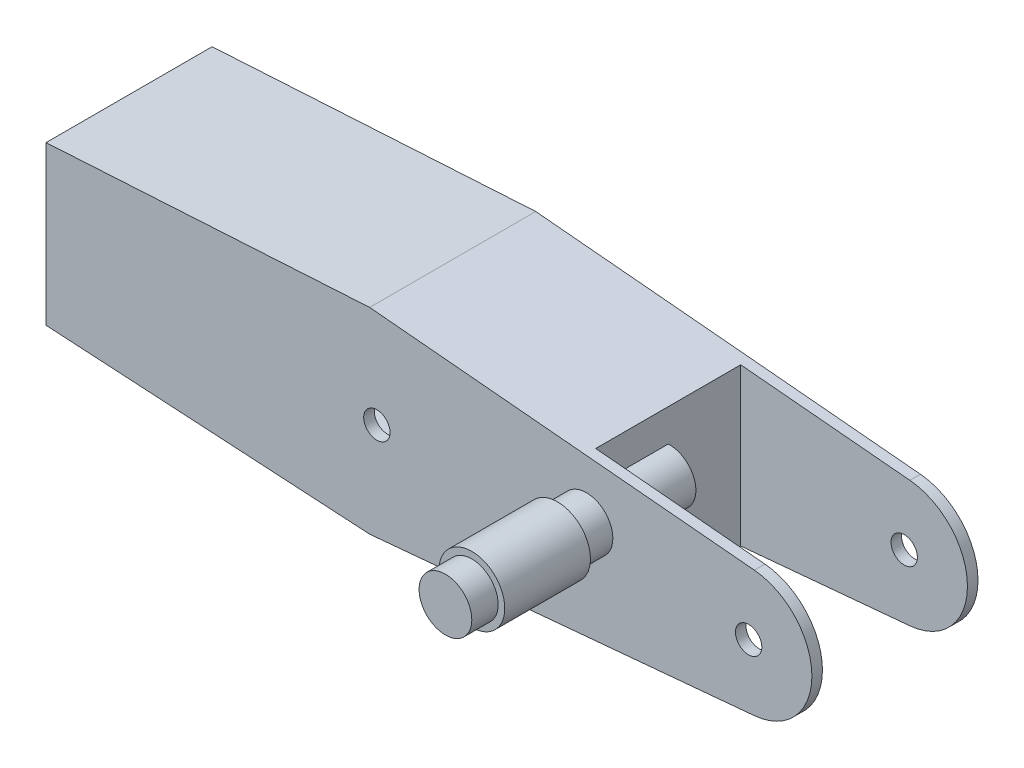
ISO-10303-21;
HEADER;
FILE_DESCRIPTION(('STEP AP214'),'2;1');
FILE_NAME('part.step','',(''),(''),'','','');
FILE_SCHEMA(('AUTOMOTIVE_DESIGN { 1 0 10303 214 1 1 1 1 }'));
ENDSEC;
DATA;
#1=APPLICATION_CONTEXT('core data for automotive mechanical design processes');
#2=APPLICATION_PROTOCOL_DEFINITION('international standard','automotive_design',2000,#1);
#3=PRODUCT_CONTEXT('',#1,'mechanical');
#4=PRODUCT('Part','Part','',(#3));
#5=PRODUCT_RELATED_PRODUCT_CATEGORY('part','',(#4));
#6=PRODUCT_DEFINITION_FORMATION('','',#4);
#7=PRODUCT_DEFINITION_CONTEXT('part definition',#1,'design');
#8=PRODUCT_DEFINITION('design','',#6,#7);
#9=PRODUCT_DEFINITION_SHAPE('','',#8);
#10=(LENGTH_UNIT() NAMED_UNIT(*) SI_UNIT(.MILLI.,.METRE.));
#11=(NAMED_UNIT(*) PLANE_ANGLE_UNIT() SI_UNIT($,.RADIAN.));
#12=(NAMED_UNIT(*) SI_UNIT($,.STERADIAN.) SOLID_ANGLE_UNIT());
#13=UNCERTAINTY_MEASURE_WITH_UNIT(LENGTH_MEASURE(1.E-05),#10,'distance_accuracy_value','');
#14=(GEOMETRIC_REPRESENTATION_CONTEXT(3) GLOBAL_UNCERTAINTY_ASSIGNED_CONTEXT((#13)) GLOBAL_UNIT_ASSIGNED_CONTEXT((#10,
#11,#12)) REPRESENTATION_CONTEXT('',''));
#15=CARTESIAN_POINT('',(0.,0.,0.));
#16=DIRECTION('',(0.,0.,1.));
#17=DIRECTION('',(1.,0.,0.));
#18=AXIS2_PLACEMENT_3D('',#15,#16,#17);
#19=CARTESIAN_POINT('',(159.,15.,213.));
#20=DIRECTION('',(0.,0.,1.));
#21=DIRECTION('',(1.,0.,0.));
#22=AXIS2_PLACEMENT_3D('',#19,#20,#21);
#23=PLANE('',#22);
#24=CARTESIAN_POINT('',(159.,15.,213.));
#25=DIRECTION('',(0.,0.,1.));
#26=DIRECTION('',(1.,0.,0.));
#27=AXIS2_PLACEMENT_3D('',#24,#25,#26);
#28=CIRCLE('',#27,25.);
#29=CARTESIAN_POINT('',(184.,15.,213.));
#30=VERTEX_POINT('',#29);
#31=EDGE_CURVE('E191',#30,#30,#28,.T.);
#32=ORIENTED_EDGE('',*,*,#31,.T.);
#33=EDGE_LOOP('',(#32));
#34=FACE_BOUND('',#33,.T.);
#35=CARTESIAN_POINT('',(159.,15.,213.));
#36=DIRECTION('',(0.,0.,1.));
#37=DIRECTION('',(1.,0.,0.));
#38=AXIS2_PLACEMENT_3D('',#35,#36,#37);
#39=CIRCLE('',#38,20.);
#40=CARTESIAN_POINT('',(179.,15.,213.));
#41=VERTEX_POINT('',#40);
#42=EDGE_CURVE('E331',#41,#41,#39,.T.);
#43=ORIENTED_EDGE('',*,*,#42,.F.);
#44=EDGE_LOOP('',(#43));
#45=FACE_BOUND('',#44,.T.);
#46=ADVANCED_FACE('F40',(#34,#45),#23,.T.);
#47=CARTESIAN_POINT('',(282.,0.,126.));
#48=DIRECTION('',(0.,0.,1.));
#49=DIRECTION('',(1.,0.,0.));
#50=AXIS2_PLACEMENT_3D('',#47,#48,#49);
#51=PLANE('',#50);
#52=CARTESIAN_POINT('',(0.,0.,126.));
#53=DIRECTION('',(0.,0.,1.));
#54=DIRECTION('',(1.,0.,0.));
#55=AXIS2_PLACEMENT_3D('',#52,#53,#54);
#56=CIRCLE('',#55,10.);
#57=CARTESIAN_POINT('',(10.,0.,126.));
#58=VERTEX_POINT('',#57);
#59=EDGE_CURVE('E749',#58,#58,#56,.T.);
#60=ORIENTED_EDGE('',*,*,#59,.F.);
#61=EDGE_LOOP('',(#60));
#62=FACE_BOUND('',#61,.T.);
#63=CARTESIAN_POINT('',(282.,0.,126.));
#64=DIRECTION('',(0.,0.,1.));
#65=DIRECTION('',(1.,0.,0.));
#66=AXIS2_PLACEMENT_3D('',#63,#64,#65);
#67=CIRCLE('',#66,9.99999999999998);
#68=CARTESIAN_POINT('',(292.,0.,126.));
#69=VERTEX_POINT('',#68);
#70=EDGE_CURVE('E334',#69,#69,#67,.T.);
#71=ORIENTED_EDGE('',*,*,#70,.F.);
#72=EDGE_LOOP('',(#71));
#73=FACE_BOUND('',#72,.T.);
#74=DIRECTION('',(-0.998260625193908,-0.0589552727706961,0.));
#75=VECTOR('',#74,1.);
#76=CARTESIAN_POINT('',(-251.,60.,126.));
#77=LINE('',#76,#75);
#78=CARTESIAN_POINT('',(-5.47863464883484,74.5,126.));
#79=VERTEX_POINT('',#78);
#80=CARTESIAN_POINT('',(-251.,60.,126.));
#81=VERTEX_POINT('',#80);
#82=EDGE_CURVE('E288',#79,#81,#77,.T.);
#83=ORIENTED_EDGE('',*,*,#82,.T.);
#84=DIRECTION('',(0.,-1.,0.));
#85=VECTOR('',#84,1.);
#86=CARTESIAN_POINT('',(-251.,60.,126.));
#87=LINE('',#86,#85);
#88=CARTESIAN_POINT('',(-251.,-60.,126.));
#89=VERTEX_POINT('',#88);
#90=EDGE_CURVE('E291',#81,#89,#87,.T.);
#91=ORIENTED_EDGE('',*,*,#90,.T.);
#92=DIRECTION('',(0.998260625193908,-0.0589552727706961,0.));
#93=VECTOR('',#92,1.);
#94=CARTESIAN_POINT('',(-251.,-60.,126.));
#95=LINE('',#94,#93);
#96=CARTESIAN_POINT('',(-5.47863464883484,-74.5,126.));
#97=VERTEX_POINT('',#96);
#98=EDGE_CURVE('E293',#89,#97,#95,.T.);
#99=ORIENTED_EDGE('',*,*,#98,.T.);
#100=DIRECTION('',(0.995841467620522,0.0911030809984231,0.));
#101=VECTOR('',#100,1.);
#102=CARTESIAN_POINT('',(-5.47863464883484,-74.5,126.));
#103=LINE('',#102,#101);
#104=CARTESIAN_POINT('',(286.372947887924,-47.800390445785,126.));
#105=VERTEX_POINT('',#104);
#106=EDGE_CURVE('E295',#97,#105,#103,.T.);
#107=ORIENTED_EDGE('',*,*,#106,.T.);
#108=CARTESIAN_POINT('',(282.,0.,126.));
#109=DIRECTION('',(0.,0.,1.));
#110=DIRECTION('',(1.,0.,0.));
#111=AXIS2_PLACEMENT_3D('',#108,#109,#110);
#112=CIRCLE('',#111,48.);
#113=CARTESIAN_POINT('',(286.372947887924,47.800390445785,126.));
#114=VERTEX_POINT('',#113);
#115=EDGE_CURVE('E297',#105,#114,#112,.T.);
#116=ORIENTED_EDGE('',*,*,#115,.T.);
#117=DIRECTION('',(-0.995841467620522,0.0911030809984231,0.));
#118=VECTOR('',#117,1.);
#119=CARTESIAN_POINT('',(-5.47863464883484,74.5,126.));
#120=LINE('',#119,#118);
#121=EDGE_CURVE('E299',#114,#79,#120,.T.);
#122=ORIENTED_EDGE('',*,*,#121,.T.);
#123=EDGE_LOOP('',(#83,#91,#99,#107,#116,#122));
#124=FACE_BOUND('',#123,.T.);
#125=CARTESIAN_POINT('',(159.,15.,126.));
#126=DIRECTION('',(0.,0.,1.));
#127=DIRECTION('',(1.,0.,0.));
#128=AXIS2_PLACEMENT_3D('',#125,#126,#127);
#129=CIRCLE('',#128,20.);
#130=CARTESIAN_POINT('',(179.,15.,126.));
#131=VERTEX_POINT('',#130);
#132=EDGE_CURVE('E186',#131,#131,#129,.F.);
#133=ORIENTED_EDGE('',*,*,#132,.T.);
#134=EDGE_LOOP('',(#133));
#135=FACE_BOUND('',#134,.T.);
#136=ADVANCED_FACE('F401',(#62,#73,#124,#135),#51,.T.);
#137=CARTESIAN_POINT('',(158.,-100.,118.));
#138=DIRECTION('',(1.,0.,0.));
#139=DIRECTION('',(0.,0.,-1.));
#140=AXIS2_PLACEMENT_3D('',#137,#138,#139);
#141=PLANE('',#140);
#142=DIRECTION('',(0.,-1.,0.));
#143=VECTOR('',#142,1.);
#144=CARTESIAN_POINT('',(158.,-100.,63.));
#145=LINE('',#144,#143);
#146=CARTESIAN_POINT('',(158.,34.9749843554382,63.));
#147=VERTEX_POINT('',#146);
#148=CARTESIAN_POINT('',(158.,-4.97498435543817,63.));
#149=VERTEX_POINT('',#148);
#150=EDGE_CURVE('E180',#147,#149,#145,.T.);
#151=ORIENTED_EDGE('',*,*,#150,.T.);
#152=DIRECTION('',(0.,0.,-1.));
#153=VECTOR('',#152,1.);
#154=CARTESIAN_POINT('',(158.,-4.97498435543817,148.));
#155=LINE('',#154,#153);
#156=CARTESIAN_POINT('',(158.,-4.97498435543817,118.));
#157=VERTEX_POINT('',#156);
#158=EDGE_CURVE('E189',#149,#157,#155,.F.);
#159=ORIENTED_EDGE('',*,*,#158,.T.);
#160=DIRECTION('',(0.,-1.,0.));
#161=VECTOR('',#160,1.);
#162=CARTESIAN_POINT('',(158.,40.,118.));
#163=LINE('',#162,#161);
#164=CARTESIAN_POINT('',(158.,-59.5443993565452,118.));
#165=VERTEX_POINT('',#164);
#166=EDGE_CURVE('E252',#157,#165,#163,.T.);
#167=ORIENTED_EDGE('',*,*,#166,.T.);
#168=DIRECTION('',(0.,0.,-1.));
#169=VECTOR('',#168,1.);
#170=CARTESIAN_POINT('',(158.,-59.5443993565452,126.));
#171=LINE('',#170,#169);
#172=CARTESIAN_POINT('',(158.,-59.5443993565452,8.00000000000001));
#173=VERTEX_POINT('',#172);
#174=EDGE_CURVE('E321',#165,#173,#171,.T.);
#175=ORIENTED_EDGE('',*,*,#174,.T.);
#176=DIRECTION('',(0.,1.,0.));
#177=VECTOR('',#176,1.);
#178=CARTESIAN_POINT('',(158.,40.,8.00000000000002));
#179=LINE('',#178,#177);
#180=CARTESIAN_POINT('',(158.,59.5443993565452,8.));
#181=VERTEX_POINT('',#180);
#182=EDGE_CURVE('E263',#173,#181,#179,.T.);
#183=ORIENTED_EDGE('',*,*,#182,.T.);
#184=DIRECTION('',(0.,0.,1.));
#185=VECTOR('',#184,1.);
#186=CARTESIAN_POINT('',(158.,59.5443993565452,8.));
#187=LINE('',#186,#185);
#188=CARTESIAN_POINT('',(158.,59.5443993565452,118.));
#189=VERTEX_POINT('',#188);
#190=EDGE_CURVE('E185',#181,#189,#187,.T.);
#191=ORIENTED_EDGE('',*,*,#190,.T.);
#192=CARTESIAN_POINT('',(158.,34.9749843554382,118.));
#193=VERTEX_POINT('',#192);
#194=EDGE_CURVE('E196',#189,#193,#163,.T.);
#195=ORIENTED_EDGE('',*,*,#194,.T.);
#196=DIRECTION('',(0.,0.,-1.));
#197=VECTOR('',#196,1.);
#198=CARTESIAN_POINT('',(158.,34.9749843554382,148.));
#199=LINE('',#198,#197);
#200=EDGE_CURVE('E57',#193,#147,#199,.T.);
#201=ORIENTED_EDGE('',*,*,#200,.T.);
#202=EDGE_LOOP('',(#151,#159,#167,#175,#183,#191,#195,#201));
#203=FACE_BOUND('',#202,.T.);
#204=ADVANCED_FACE('F194',(#203),#141,.T.);
#205=CARTESIAN_POINT('',(358.,40.,118.));
#206=DIRECTION('',(0.,0.,-1.));
#207=DIRECTION('',(0.,1.,0.));
#208=AXIS2_PLACEMENT_3D('',#205,#206,#207);
#209=PLANE('',#208);
#210=CARTESIAN_POINT('',(282.,0.,118.));
#211=DIRECTION('',(0.,0.,-1.));
#212=DIRECTION('',(0.,1.,0.));
#213=AXIS2_PLACEMENT_3D('',#210,#211,#212);
#214=CIRCLE('',#213,9.99999999999998);
#215=CARTESIAN_POINT('',(282.,9.99999999999998,118.));
#216=VERTEX_POINT('',#215);
#217=EDGE_CURVE('E326',#216,#216,#214,.T.);
#218=ORIENTED_EDGE('',*,*,#217,.F.);
#219=EDGE_LOOP('',(#218));
#220=FACE_BOUND('',#219,.T.);
#221=ORIENTED_EDGE('',*,*,#166,.F.);
#222=CARTESIAN_POINT('',(159.,15.,118.));
#223=DIRECTION('',(0.,0.,-1.));
#224=DIRECTION('',(0.,1.,0.));
#225=AXIS2_PLACEMENT_3D('',#222,#223,#224);
#226=CIRCLE('',#225,20.);
#227=EDGE_CURVE('E197',#157,#193,#226,.F.);
#228=ORIENTED_EDGE('',*,*,#227,.T.);
#229=ORIENTED_EDGE('',*,*,#194,.F.);
#230=DIRECTION('',(-0.995841467620522,0.0911030809984231,0.));
#231=VECTOR('',#230,1.);
#232=CARTESIAN_POINT('',(-5.47863464883484,74.5,118.));
#233=LINE('',#232,#231);
#234=CARTESIAN_POINT('',(286.372947887924,47.800390445785,118.));
#235=VERTEX_POINT('',#234);
#236=EDGE_CURVE('E206',#235,#189,#233,.T.);
#237=ORIENTED_EDGE('',*,*,#236,.F.);
#238=CARTESIAN_POINT('',(282.,0.,118.));
#239=DIRECTION('',(0.,0.,-1.));
#240=DIRECTION('',(0.,1.,0.));
#241=AXIS2_PLACEMENT_3D('',#238,#239,#240);
#242=CIRCLE('',#241,48.);
#243=CARTESIAN_POINT('',(286.372947887924,-47.800390445785,118.));
#244=VERTEX_POINT('',#243);
#245=EDGE_CURVE('E319',#235,#244,#242,.T.);
#246=ORIENTED_EDGE('',*,*,#245,.T.);
#247=DIRECTION('',(-0.995841467620522,-0.0911030809984231,0.));
#248=VECTOR('',#247,1.);
#249=CARTESIAN_POINT('',(-5.47863464883484,-74.5,118.));
#250=LINE('',#249,#248);
#251=EDGE_CURVE('E267',#244,#165,#250,.T.);
#252=ORIENTED_EDGE('',*,*,#251,.T.);
#253=EDGE_LOOP('',(#221,#228,#229,#237,#246,#252));
#254=FACE_BOUND('',#253,.T.);
#255=ADVANCED_FACE('F444',(#220,#254),#209,.T.);
#256=CARTESIAN_POINT('',(282.,0.,126.));
#257=DIRECTION('',(0.,0.,-1.));
#258=DIRECTION('',(-1.,0.,0.));
#259=AXIS2_PLACEMENT_3D('',#256,#257,#258);
#260=CYLINDRICAL_SURFACE('',#259,48.);
#261=DIRECTION('',(0.,0.,-1.));
#262=VECTOR('',#261,1.);
#263=CARTESIAN_POINT('',(286.372947887924,47.800390445785,126.));
#264=LINE('',#263,#262);
#265=CARTESIAN_POINT('',(286.372947887924,47.800390445785,8.00000000000001));
#266=VERTEX_POINT('',#265);
#267=CARTESIAN_POINT('',(286.372947887924,47.800390445785,0.));
#268=VERTEX_POINT('',#267);
#269=EDGE_CURVE('E303',#266,#268,#264,.T.);
#270=ORIENTED_EDGE('',*,*,#269,.F.);
#271=CARTESIAN_POINT('',(282.,0.,8.00000000000002));
#272=DIRECTION('',(0.,0.,1.));
#273=DIRECTION('',(0.,-1.,0.));
#274=AXIS2_PLACEMENT_3D('',#271,#272,#273);
#275=CIRCLE('',#274,48.);
#276=CARTESIAN_POINT('',(286.372947887924,-47.800390445785,8.00000000000001));
#277=VERTEX_POINT('',#276);
#278=EDGE_CURVE('E317',#277,#266,#275,.T.);
#279=ORIENTED_EDGE('',*,*,#278,.F.);
#280=DIRECTION('',(0.,0.,-1.));
#281=VECTOR('',#280,1.);
#282=CARTESIAN_POINT('',(286.372947887924,-47.800390445785,126.));
#283=LINE('',#282,#281);
#284=CARTESIAN_POINT('',(286.372947887924,-47.800390445785,0.));
#285=VERTEX_POINT('',#284);
#286=EDGE_CURVE('E307',#277,#285,#283,.T.);
#287=ORIENTED_EDGE('',*,*,#286,.T.);
#288=CARTESIAN_POINT('',(282.,0.,0.));
#289=DIRECTION('',(0.,0.,1.));
#290=DIRECTION('',(1.,0.,0.));
#291=AXIS2_PLACEMENT_3D('',#288,#289,#290);
#292=CIRCLE('',#291,48.);
#293=EDGE_CURVE('E282',#285,#268,#292,.T.);
#294=ORIENTED_EDGE('',*,*,#293,.T.);
#295=EDGE_LOOP('',(#270,#279,#287,#294));
#296=FACE_BOUND('',#295,.T.);
#297=ADVANCED_FACE('F451',(#296),#260,.T.);
#298=CARTESIAN_POINT('',(-5.47863464883484,-74.5,126.));
#299=DIRECTION('',(-0.0911030809984231,0.995841467620522,0.));
#300=DIRECTION('',(-0.995841467620522,-0.0911030809984231,0.));
#301=AXIS2_PLACEMENT_3D('',#298,#299,#300);
#302=PLANE('',#301);
#303=DIRECTION('',(0.,0.,-1.));
#304=VECTOR('',#303,1.);
#305=CARTESIAN_POINT('',(-5.47863464883484,-74.5,126.));
#306=LINE('',#305,#304);
#307=CARTESIAN_POINT('',(-5.47863464883484,-74.5,0.));
#308=VERTEX_POINT('',#307);
#309=EDGE_CURVE('E311',#97,#308,#306,.T.);
#310=ORIENTED_EDGE('',*,*,#309,.T.);
#311=DIRECTION('',(0.995841467620522,0.0911030809984231,0.));
#312=VECTOR('',#311,1.);
#313=CARTESIAN_POINT('',(-5.47863464883484,-74.5,0.));
#314=LINE('',#313,#312);
#315=EDGE_CURVE('E279',#308,#285,#314,.T.);
#316=ORIENTED_EDGE('',*,*,#315,.T.);
#317=ORIENTED_EDGE('',*,*,#286,.F.);
#318=DIRECTION('',(0.995841467620522,0.0911030809984231,0.));
#319=VECTOR('',#318,1.);
#320=CARTESIAN_POINT('',(-5.47863464883483,-74.5,8.00000000000001));
#321=LINE('',#320,#319);
#322=EDGE_CURVE('E265',#173,#277,#321,.T.);
#323=ORIENTED_EDGE('',*,*,#322,.F.);
#324=ORIENTED_EDGE('',*,*,#174,.F.);
#325=ORIENTED_EDGE('',*,*,#251,.F.);
#326=EDGE_CURVE('E308',#105,#244,#283,.T.);
#327=ORIENTED_EDGE('',*,*,#326,.F.);
#328=ORIENTED_EDGE('',*,*,#106,.F.);
#329=EDGE_LOOP('',(#310,#316,#317,#323,#324,#325,#327,#328));
#330=FACE_BOUND('',#329,.T.);
#331=ADVANCED_FACE('F464',(#330),#302,.F.);
#332=ORIENTED_EDGE('',*,*,#245,.F.);
#333=EDGE_CURVE('E304',#114,#235,#264,.T.);
#334=ORIENTED_EDGE('',*,*,#333,.F.);
#335=ORIENTED_EDGE('',*,*,#115,.F.);
#336=ORIENTED_EDGE('',*,*,#326,.T.);
#337=EDGE_LOOP('',(#332,#334,#335,#336));
#338=FACE_BOUND('',#337,.T.);
#339=ADVANCED_FACE('F461',(#338),#260,.T.);
#340=CARTESIAN_POINT('',(-251.,60.,126.));
#341=DIRECTION('',(0.0589552727706961,-0.998260625193908,0.));
#342=DIRECTION('',(0.998260625193908,0.0589552727706961,0.));
#343=AXIS2_PLACEMENT_3D('',#340,#341,#342);
#344=PLANE('',#343);
#345=DIRECTION('',(0.,0.,-1.));
#346=VECTOR('',#345,1.);
#347=CARTESIAN_POINT('',(-5.47863464883484,74.5,126.));
#348=LINE('',#347,#346);
#349=CARTESIAN_POINT('',(-5.47863464883484,74.5,0.));
#350=VERTEX_POINT('',#349);
#351=EDGE_CURVE('E301',#79,#350,#348,.T.);
#352=ORIENTED_EDGE('',*,*,#351,.T.);
#353=DIRECTION('',(-0.998260625193908,-0.0589552727706961,0.));
#354=VECTOR('',#353,1.);
#355=CARTESIAN_POINT('',(-251.,60.,0.));
#356=LINE('',#355,#354);
#357=CARTESIAN_POINT('',(-251.,60.,0.));
#358=VERTEX_POINT('',#357);
#359=EDGE_CURVE('E270',#350,#358,#356,.T.);
#360=ORIENTED_EDGE('',*,*,#359,.T.);
#361=DIRECTION('',(0.,0.,-1.));
#362=VECTOR('',#361,1.);
#363=CARTESIAN_POINT('',(-251.,60.,126.));
#364=LINE('',#363,#362);
#365=EDGE_CURVE('E315',#81,#358,#364,.T.);
#366=ORIENTED_EDGE('',*,*,#365,.F.);
#367=ORIENTED_EDGE('',*,*,#82,.F.);
#368=EDGE_LOOP('',(#352,#360,#366,#367));
#369=FACE_BOUND('',#368,.T.);
#370=ADVANCED_FACE('F42',(#369),#344,.F.);
#371=CARTESIAN_POINT('',(-251.,60.,126.));
#372=DIRECTION('',(1.,0.,0.));
#373=DIRECTION('',(0.,0.,-1.));
#374=AXIS2_PLACEMENT_3D('',#371,#372,#373);
#375=PLANE('',#374);
#376=ORIENTED_EDGE('',*,*,#365,.T.);
#377=DIRECTION('',(0.,-1.,0.));
#378=VECTOR('',#377,1.);
#379=CARTESIAN_POINT('',(-251.,60.,0.));
#380=LINE('',#379,#378);
#381=CARTESIAN_POINT('',(-251.,-60.,0.));
#382=VERTEX_POINT('',#381);
#383=EDGE_CURVE('E273',#358,#382,#380,.T.);
#384=ORIENTED_EDGE('',*,*,#383,.T.);
#385=DIRECTION('',(0.,0.,-1.));
#386=VECTOR('',#385,1.);
#387=CARTESIAN_POINT('',(-251.,-60.,126.));
#388=LINE('',#387,#386);
#389=EDGE_CURVE('E313',#89,#382,#388,.T.);
#390=ORIENTED_EDGE('',*,*,#389,.F.);
#391=ORIENTED_EDGE('',*,*,#90,.F.);
#392=EDGE_LOOP('',(#376,#384,#390,#391));
#393=FACE_BOUND('',#392,.T.);
#394=ADVANCED_FACE('F470',(#393),#375,.F.);
#395=CARTESIAN_POINT('',(-251.,-60.,126.));
#396=DIRECTION('',(0.0589552727706961,0.998260625193908,0.));
#397=DIRECTION('',(-0.998260625193908,0.0589552727706961,0.));
#398=AXIS2_PLACEMENT_3D('',#395,#396,#397);
#399=PLANE('',#398);
#400=ORIENTED_EDGE('',*,*,#389,.T.);
#401=DIRECTION('',(0.998260625193908,-0.0589552727706961,0.));
#402=VECTOR('',#401,1.);
#403=CARTESIAN_POINT('',(-251.,-60.,0.));
#404=LINE('',#403,#402);
#405=EDGE_CURVE('E276',#382,#308,#404,.T.);
#406=ORIENTED_EDGE('',*,*,#405,.T.);
#407=ORIENTED_EDGE('',*,*,#309,.F.);
#408=ORIENTED_EDGE('',*,*,#98,.F.);
#409=EDGE_LOOP('',(#400,#406,#407,#408));
#410=FACE_BOUND('',#409,.T.);
#411=ADVANCED_FACE('F459',(#410),#399,.F.);
#412=CARTESIAN_POINT('',(-5.47863464883484,74.5,126.));
#413=DIRECTION('',(-0.0911030809984231,-0.995841467620522,0.));
#414=DIRECTION('',(0.995841467620522,-0.0911030809984231,0.));
#415=AXIS2_PLACEMENT_3D('',#412,#413,#414);
#416=PLANE('',#415);
#417=ORIENTED_EDGE('',*,*,#333,.T.);
#418=ORIENTED_EDGE('',*,*,#236,.T.);
#419=ORIENTED_EDGE('',*,*,#190,.F.);
#420=DIRECTION('',(-0.995841467620522,0.0911030809984231,0.));
#421=VECTOR('',#420,1.);
#422=CARTESIAN_POINT('',(-5.47863464883484,74.5,8.00000000000001));
#423=LINE('',#422,#421);
#424=EDGE_CURVE('E209',#266,#181,#423,.T.);
#425=ORIENTED_EDGE('',*,*,#424,.F.);
#426=ORIENTED_EDGE('',*,*,#269,.T.);
#427=DIRECTION('',(-0.995841467620522,0.0911030809984231,0.));
#428=VECTOR('',#427,1.);
#429=CARTESIAN_POINT('',(-5.47863464883484,74.5,0.));
#430=LINE('',#429,#428);
#431=EDGE_CURVE('E285',#268,#350,#430,.T.);
#432=ORIENTED_EDGE('',*,*,#431,.T.);
#433=ORIENTED_EDGE('',*,*,#351,.F.);
#434=ORIENTED_EDGE('',*,*,#121,.F.);
#435=EDGE_LOOP('',(#417,#418,#419,#425,#426,#432,#433,#434));
#436=FACE_BOUND('',#435,.T.);
#437=ADVANCED_FACE('F454',(#436),#416,.F.);
#438=CARTESIAN_POINT('',(282.,0.,0.));
#439=DIRECTION('',(0.,0.,1.));
#440=DIRECTION('',(1.,0.,0.));
#441=AXIS2_PLACEMENT_3D('',#438,#439,#440);
#442=PLANE('',#441);
#443=CARTESIAN_POINT('',(0.,0.,0.));
#444=DIRECTION('',(0.,0.,1.));
#445=DIRECTION('',(1.,0.,0.));
#446=AXIS2_PLACEMENT_3D('',#443,#444,#445);
#447=CIRCLE('',#446,10.);
#448=CARTESIAN_POINT('',(10.,0.,0.));
#449=VERTEX_POINT('',#448);
#450=EDGE_CURVE('E753',#449,#449,#447,.T.);
#451=ORIENTED_EDGE('',*,*,#450,.T.);
#452=EDGE_LOOP('',(#451));
#453=FACE_BOUND('',#452,.T.);
#454=CARTESIAN_POINT('',(282.,0.,0.));
#455=DIRECTION('',(0.,0.,1.));
#456=DIRECTION('',(1.,0.,0.));
#457=AXIS2_PLACEMENT_3D('',#454,#455,#456);
#458=CIRCLE('',#457,9.99999999999998);
#459=CARTESIAN_POINT('',(292.,0.,0.));
#460=VERTEX_POINT('',#459);
#461=EDGE_CURVE('E327',#460,#460,#458,.T.);
#462=ORIENTED_EDGE('',*,*,#461,.T.);
#463=EDGE_LOOP('',(#462));
#464=FACE_BOUND('',#463,.T.);
#465=ORIENTED_EDGE('',*,*,#359,.F.);
#466=ORIENTED_EDGE('',*,*,#431,.F.);
#467=ORIENTED_EDGE('',*,*,#293,.F.);
#468=ORIENTED_EDGE('',*,*,#315,.F.);
#469=ORIENTED_EDGE('',*,*,#405,.F.);
#470=ORIENTED_EDGE('',*,*,#383,.F.);
#471=EDGE_LOOP('',(#465,#466,#467,#468,#469,#470));
#472=FACE_BOUND('',#471,.T.);
#473=ADVANCED_FACE('F447',(#453,#464,#472),#442,.F.);
#474=CARTESIAN_POINT('',(358.,40.,8.00000000000002));
#475=DIRECTION('',(0.,0.,1.));
#476=DIRECTION('',(0.,-1.,0.));
#477=AXIS2_PLACEMENT_3D('',#474,#475,#476);
#478=PLANE('',#477);
#479=CARTESIAN_POINT('',(282.,0.,8.00000000000002));
#480=DIRECTION('',(0.,0.,1.));
#481=DIRECTION('',(0.,-1.,0.));
#482=AXIS2_PLACEMENT_3D('',#479,#480,#481);
#483=CIRCLE('',#482,9.99999999999998);
#484=CARTESIAN_POINT('',(282.,-9.99999999999998,8.00000000000001));
#485=VERTEX_POINT('',#484);
#486=EDGE_CURVE('E324',#485,#485,#483,.T.);
#487=ORIENTED_EDGE('',*,*,#486,.F.);
#488=EDGE_LOOP('',(#487));
#489=FACE_BOUND('',#488,.T.);
#490=ORIENTED_EDGE('',*,*,#322,.T.);
#491=ORIENTED_EDGE('',*,*,#278,.T.);
#492=ORIENTED_EDGE('',*,*,#424,.T.);
#493=ORIENTED_EDGE('',*,*,#182,.F.);
#494=EDGE_LOOP('',(#490,#491,#492,#493));
#495=FACE_BOUND('',#494,.T.);
#496=ADVANCED_FACE('F424',(#489,#495),#478,.T.);
#497=CARTESIAN_POINT('',(159.,15.,148.));
#498=DIRECTION('',(0.,0.,-1.));
#499=DIRECTION('',(-1.,0.,0.));
#500=AXIS2_PLACEMENT_3D('',#497,#498,#499);
#501=CYLINDRICAL_SURFACE('',#500,20.);
#502=ORIENTED_EDGE('',*,*,#158,.F.);
#503=CARTESIAN_POINT('',(159.,15.,63.));
#504=DIRECTION('',(0.,0.,1.));
#505=DIRECTION('',(1.,0.,0.));
#506=AXIS2_PLACEMENT_3D('',#503,#504,#505);
#507=CIRCLE('',#506,20.);
#508=EDGE_CURVE('E182',#149,#147,#507,.T.);
#509=ORIENTED_EDGE('',*,*,#508,.T.);
#510=ORIENTED_EDGE('',*,*,#200,.F.);
#511=ORIENTED_EDGE('',*,*,#227,.F.);
#512=EDGE_LOOP('',(#502,#509,#510,#511));
#513=FACE_BOUND('',#512,.T.);
#514=ADVANCED_FACE('F188',(#513),#501,.T.);
#515=CARTESIAN_POINT('',(159.,15.,63.));
#516=DIRECTION('',(0.,0.,1.));
#517=DIRECTION('',(1.,0.,0.));
#518=AXIS2_PLACEMENT_3D('',#515,#516,#517);
#519=PLANE('',#518);
#520=ORIENTED_EDGE('',*,*,#150,.F.);
#521=ORIENTED_EDGE('',*,*,#508,.F.);
#522=EDGE_LOOP('',(#520,#521));
#523=FACE_BOUND('',#522,.T.);
#524=ADVANCED_FACE('F181',(#523),#519,.F.);
#525=ORIENTED_EDGE('',*,*,#132,.F.);
#526=EDGE_LOOP('',(#525));
#527=FACE_BOUND('',#526,.T.);
#528=CARTESIAN_POINT('',(159.,15.,148.));
#529=DIRECTION('',(0.,0.,1.));
#530=DIRECTION('',(1.,0.,0.));
#531=AXIS2_PLACEMENT_3D('',#528,#529,#530);
#532=CIRCLE('',#531,20.);
#533=CARTESIAN_POINT('',(179.,15.,148.));
#534=VERTEX_POINT('',#533);
#535=EDGE_CURVE('E353',#534,#534,#532,.T.);
#536=ORIENTED_EDGE('',*,*,#535,.F.);
#537=EDGE_LOOP('',(#536));
#538=FACE_BOUND('',#537,.T.);
#539=ADVANCED_FACE('F421',(#527,#538),#501,.T.);
#540=CARTESIAN_POINT('',(159.,15.,148.));
#541=DIRECTION('',(0.,0.,1.));
#542=DIRECTION('',(1.,0.,0.));
#543=AXIS2_PLACEMENT_3D('',#540,#541,#542);
#544=PLANE('',#543);
#545=CARTESIAN_POINT('',(159.,15.,148.));
#546=DIRECTION('',(0.,0.,1.));
#547=DIRECTION('',(1.,0.,0.));
#548=AXIS2_PLACEMENT_3D('',#545,#546,#547);
#549=CIRCLE('',#548,25.);
#550=CARTESIAN_POINT('',(184.,15.,148.));
#551=VERTEX_POINT('',#550);
#552=EDGE_CURVE('E348',#551,#551,#549,.T.);
#553=ORIENTED_EDGE('',*,*,#552,.F.);
#554=EDGE_LOOP('',(#553));
#555=FACE_BOUND('',#554,.T.);
#556=ORIENTED_EDGE('',*,*,#535,.T.);
#557=EDGE_LOOP('',(#556));
#558=FACE_BOUND('',#557,.T.);
#559=ADVANCED_FACE('F412',(#555,#558),#544,.F.);
#560=CARTESIAN_POINT('',(159.,15.,213.));
#561=DIRECTION('',(0.,0.,-1.));
#562=DIRECTION('',(-1.,0.,0.));
#563=AXIS2_PLACEMENT_3D('',#560,#561,#562);
#564=CYLINDRICAL_SURFACE('',#563,25.);
#565=ORIENTED_EDGE('',*,*,#31,.F.);
#566=EDGE_LOOP('',(#565));
#567=FACE_BOUND('',#566,.T.);
#568=ORIENTED_EDGE('',*,*,#552,.T.);
#569=EDGE_LOOP('',(#568));
#570=FACE_BOUND('',#569,.T.);
#571=ADVANCED_FACE('F414',(#567,#570),#564,.T.);
#572=CARTESIAN_POINT('',(159.,15.,233.));
#573=DIRECTION('',(0.,0.,-1.));
#574=DIRECTION('',(-1.,0.,0.));
#575=AXIS2_PLACEMENT_3D('',#572,#573,#574);
#576=CYLINDRICAL_SURFACE('',#575,20.);
#577=CARTESIAN_POINT('',(159.,15.,233.));
#578=DIRECTION('',(0.,0.,1.));
#579=DIRECTION('',(1.,0.,0.));
#580=AXIS2_PLACEMENT_3D('',#577,#578,#579);
#581=CIRCLE('',#580,20.);
#582=CARTESIAN_POINT('',(179.,15.,233.));
#583=VERTEX_POINT('',#582);
#584=EDGE_CURVE('E345',#583,#583,#581,.T.);
#585=ORIENTED_EDGE('',*,*,#584,.F.);
#586=EDGE_LOOP('',(#585));
#587=FACE_BOUND('',#586,.T.);
#588=ORIENTED_EDGE('',*,*,#42,.T.);
#589=EDGE_LOOP('',(#588));
#590=FACE_BOUND('',#589,.T.);
#591=ADVANCED_FACE('F417',(#587,#590),#576,.T.);
#592=CARTESIAN_POINT('',(159.,15.,233.));
#593=DIRECTION('',(0.,0.,1.));
#594=DIRECTION('',(1.,0.,0.));
#595=AXIS2_PLACEMENT_3D('',#592,#593,#594);
#596=PLANE('',#595);
#597=ORIENTED_EDGE('',*,*,#584,.T.);
#598=EDGE_LOOP('',(#597));
#599=FACE_BOUND('',#598,.T.);
#600=ADVANCED_FACE('F537',(#599),#596,.T.);
#601=CARTESIAN_POINT('',(282.,0.,0.));
#602=DIRECTION('',(0.,0.,1.));
#603=DIRECTION('',(1.,0.,0.));
#604=AXIS2_PLACEMENT_3D('',#601,#602,#603);
#605=CYLINDRICAL_SURFACE('',#604,9.99999999999998);
#606=ORIENTED_EDGE('',*,*,#486,.T.);
#607=EDGE_LOOP('',(#606));
#608=FACE_BOUND('',#607,.T.);
#609=ORIENTED_EDGE('',*,*,#461,.F.);
#610=EDGE_LOOP('',(#609));
#611=FACE_BOUND('',#610,.T.);
#612=ADVANCED_FACE('F544',(#608,#611),#605,.F.);
#613=ORIENTED_EDGE('',*,*,#217,.T.);
#614=EDGE_LOOP('',(#613));
#615=FACE_BOUND('',#614,.T.);
#616=ORIENTED_EDGE('',*,*,#70,.T.);
#617=EDGE_LOOP('',(#616));
#618=FACE_BOUND('',#617,.T.);
#619=ADVANCED_FACE('F553',(#615,#618),#605,.F.);
#620=CARTESIAN_POINT('',(0.,0.,0.));
#621=DIRECTION('',(0.,0.,1.));
#622=DIRECTION('',(1.,0.,0.));
#623=AXIS2_PLACEMENT_3D('',#620,#621,#622);
#624=CYLINDRICAL_SURFACE('',#623,10.);
#625=CARTESIAN_POINT('',(0.,0.,8.));
#626=DIRECTION('',(0.,0.,1.));
#627=DIRECTION('',(1.,0.,0.));
#628=AXIS2_PLACEMENT_3D('',#625,#626,#627);
#629=CIRCLE('',#628,10.);
#630=CARTESIAN_POINT('',(10.,0.,8.));
#631=VERTEX_POINT('',#630);
#632=EDGE_CURVE('E44',#631,#631,#629,.T.);
#633=ORIENTED_EDGE('',*,*,#632,.T.);
#634=EDGE_LOOP('',(#633));
#635=FACE_BOUND('',#634,.T.);
#636=ORIENTED_EDGE('',*,*,#450,.F.);
#637=EDGE_LOOP('',(#636));
#638=FACE_BOUND('',#637,.T.);
#639=ADVANCED_FACE('F561',(#635,#638),#624,.F.);
#640=ORIENTED_EDGE('',*,*,#59,.T.);
#641=EDGE_LOOP('',(#640));
#642=FACE_BOUND('',#641,.T.);
#643=CARTESIAN_POINT('',(0.,0.,118.));
#644=DIRECTION('',(0.,0.,1.));
#645=DIRECTION('',(1.,0.,0.));
#646=AXIS2_PLACEMENT_3D('',#643,#644,#645);
#647=CIRCLE('',#646,10.);
#648=CARTESIAN_POINT('',(10.,0.,118.));
#649=VERTEX_POINT('',#648);
#650=EDGE_CURVE('E339',#649,#649,#647,.T.);
#651=ORIENTED_EDGE('',*,*,#650,.F.);
#652=EDGE_LOOP('',(#651));
#653=FACE_BOUND('',#652,.T.);
#654=ADVANCED_FACE('F433',(#642,#653),#624,.F.);
#655=CARTESIAN_POINT('',(152.,54.068245077652,8.));
#656=DIRECTION('',(1.,0.,0.));
#657=DIRECTION('',(0.,1.,0.));
#658=AXIS2_PLACEMENT_3D('',#655,#656,#657);
#659=PLANE('',#658);
#660=DIRECTION('',(0.,0.,-1.));
#661=VECTOR('',#660,1.);
#662=CARTESIAN_POINT('',(152.,-3.73499399519517,148.));
#663=LINE('',#662,#661);
#664=CARTESIAN_POINT('',(152.,-3.73499399519518,63.));
#665=VERTEX_POINT('',#664);
#666=CARTESIAN_POINT('',(152.,-3.73499399519518,118.));
#667=VERTEX_POINT('',#666);
#668=EDGE_CURVE('E65',#665,#667,#663,.F.);
#669=ORIENTED_EDGE('',*,*,#668,.F.);
#670=DIRECTION('',(0.,-1.,0.));
#671=VECTOR('',#670,1.);
#672=CARTESIAN_POINT('',(152.,54.068245077652,63.));
#673=LINE('',#672,#671);
#674=CARTESIAN_POINT('',(152.,33.7349939951952,63.));
#675=VERTEX_POINT('',#674);
#676=EDGE_CURVE('E12',#675,#665,#673,.T.);
#677=ORIENTED_EDGE('',*,*,#676,.F.);
#678=DIRECTION('',(0.,0.,-1.));
#679=VECTOR('',#678,1.);
#680=CARTESIAN_POINT('',(152.,33.7349939951952,148.));
#681=LINE('',#680,#679);
#682=CARTESIAN_POINT('',(152.,33.7349939951952,118.));
#683=VERTEX_POINT('',#682);
#684=EDGE_CURVE('E356',#683,#675,#681,.T.);
#685=ORIENTED_EDGE('',*,*,#684,.F.);
#686=DIRECTION('',(0.,1.,0.));
#687=VECTOR('',#686,1.);
#688=CARTESIAN_POINT('',(152.,54.068245077652,118.));
#689=LINE('',#688,#687);
#690=CARTESIAN_POINT('',(152.,54.068245077652,118.));
#691=VERTEX_POINT('',#690);
#692=EDGE_CURVE('E227',#683,#691,#689,.T.);
#693=ORIENTED_EDGE('',*,*,#692,.T.);
#694=DIRECTION('',(0.,0.,1.));
#695=VECTOR('',#694,1.);
#696=CARTESIAN_POINT('',(152.,54.068245077652,8.));
#697=LINE('',#696,#695);
#698=CARTESIAN_POINT('',(152.,54.068245077652,8.));
#699=VERTEX_POINT('',#698);
#700=EDGE_CURVE('E249',#699,#691,#697,.T.);
#701=ORIENTED_EDGE('',*,*,#700,.F.);
#702=DIRECTION('',(0.,1.,0.));
#703=VECTOR('',#702,1.);
#704=CARTESIAN_POINT('',(152.,54.068245077652,8.));
#705=LINE('',#704,#703);
#706=CARTESIAN_POINT('',(152.,-54.068245077652,8.));
#707=VERTEX_POINT('',#706);
#708=EDGE_CURVE('E245',#707,#699,#705,.T.);
#709=ORIENTED_EDGE('',*,*,#708,.F.);
#710=DIRECTION('',(0.,0.,1.));
#711=VECTOR('',#710,1.);
#712=CARTESIAN_POINT('',(152.,-54.068245077652,8.));
#713=LINE('',#712,#711);
#714=CARTESIAN_POINT('',(152.,-54.068245077652,118.));
#715=VERTEX_POINT('',#714);
#716=EDGE_CURVE('E253',#707,#715,#713,.T.);
#717=ORIENTED_EDGE('',*,*,#716,.T.);
#718=EDGE_CURVE('E228',#715,#667,#689,.T.);
#719=ORIENTED_EDGE('',*,*,#718,.T.);
#720=EDGE_LOOP('',(#669,#677,#685,#693,#701,#709,#717,#719));
#721=FACE_BOUND('',#720,.T.);
#722=ADVANCED_FACE('F365',(#721),#659,.F.);
#723=CARTESIAN_POINT('',(-245.,90.3872017915094,118.));
#724=DIRECTION('',(0.,0.,1.));
#725=DIRECTION('',(1.,0.,0.));
#726=AXIS2_PLACEMENT_3D('',#723,#724,#725);
#727=PLANE('',#726);
#728=ORIENTED_EDGE('',*,*,#650,.T.);
#729=EDGE_LOOP('',(#728));
#730=FACE_BOUND('',#729,.T.);
#731=CARTESIAN_POINT('',(159.,15.,118.));
#732=DIRECTION('',(0.,0.,1.));
#733=DIRECTION('',(1.,0.,0.));
#734=AXIS2_PLACEMENT_3D('',#731,#732,#733);
#735=CIRCLE('',#734,20.);
#736=EDGE_CURVE('E49',#667,#683,#735,.F.);
#737=ORIENTED_EDGE('',*,*,#736,.F.);
#738=ORIENTED_EDGE('',*,*,#718,.F.);
#739=DIRECTION('',(0.995841467620522,0.0911030809984231,0.));
#740=VECTOR('',#739,1.);
#741=CARTESIAN_POINT('',(-5.57562420624258,-68.4838175580187,118.));
#742=LINE('',#741,#740);
#743=CARTESIAN_POINT('',(-5.57562420624258,-68.4838175580187,118.));
#744=VERTEX_POINT('',#743);
#745=EDGE_CURVE('E224',#744,#715,#742,.T.);
#746=ORIENTED_EDGE('',*,*,#745,.F.);
#747=DIRECTION('',(0.998260625193908,-0.0589552727706961,0.));
#748=VECTOR('',#747,1.);
#749=CARTESIAN_POINT('',(-245.,-54.3438935475602,118.));
#750=LINE('',#749,#748);
#751=CARTESIAN_POINT('',(-245.,-54.3438935475602,118.));
#752=VERTEX_POINT('',#751);
#753=EDGE_CURVE('E221',#752,#744,#750,.T.);
#754=ORIENTED_EDGE('',*,*,#753,.F.);
#755=DIRECTION('',(0.,-1.,0.));
#756=VECTOR('',#755,1.);
#757=CARTESIAN_POINT('',(-245.,54.3438935475602,118.));
#758=LINE('',#757,#756);
#759=CARTESIAN_POINT('',(-245.,54.3438935475602,118.));
#760=VERTEX_POINT('',#759);
#761=EDGE_CURVE('E218',#760,#752,#758,.T.);
#762=ORIENTED_EDGE('',*,*,#761,.F.);
#763=DIRECTION('',(-0.998260625193908,-0.0589552727706961,0.));
#764=VECTOR('',#763,1.);
#765=CARTESIAN_POINT('',(-5.57562420624258,68.4838175580187,118.));
#766=LINE('',#765,#764);
#767=CARTESIAN_POINT('',(-5.57562420624258,68.4838175580187,118.));
#768=VERTEX_POINT('',#767);
#769=EDGE_CURVE('E215',#768,#760,#766,.T.);
#770=ORIENTED_EDGE('',*,*,#769,.F.);
#771=DIRECTION('',(-0.995841467620522,0.0911030809984232,0.));
#772=VECTOR('',#771,1.);
#773=CARTESIAN_POINT('',(152.,54.068245077652,118.));
#774=LINE('',#773,#772);
#775=EDGE_CURVE('E212',#691,#768,#774,.T.);
#776=ORIENTED_EDGE('',*,*,#775,.F.);
#777=ORIENTED_EDGE('',*,*,#692,.F.);
#778=EDGE_LOOP('',(#737,#738,#746,#754,#762,#770,#776,#777));
#779=FACE_BOUND('',#778,.T.);
#780=ADVANCED_FACE('F373',(#730,#779),#727,.F.);
#781=CARTESIAN_POINT('',(152.,54.068245077652,8.));
#782=DIRECTION('',(0.0911030809984232,0.995841467620522,0.));
#783=DIRECTION('',(-0.995841467620522,0.0911030809984232,0.));
#784=AXIS2_PLACEMENT_3D('',#781,#782,#783);
#785=PLANE('',#784);
#786=DIRECTION('',(0.,0.,1.));
#787=VECTOR('',#786,1.);
#788=CARTESIAN_POINT('',(-5.57562420624258,68.4838175580187,8.));
#789=LINE('',#788,#787);
#790=CARTESIAN_POINT('',(-5.57562420624258,68.4838175580187,8.));
#791=VERTEX_POINT('',#790);
#792=EDGE_CURVE('E248',#791,#768,#789,.T.);
#793=ORIENTED_EDGE('',*,*,#792,.F.);
#794=DIRECTION('',(-0.995841467620522,0.0911030809984232,0.));
#795=VECTOR('',#794,1.);
#796=CARTESIAN_POINT('',(152.,54.068245077652,8.));
#797=LINE('',#796,#795);
#798=EDGE_CURVE('E230',#699,#791,#797,.T.);
#799=ORIENTED_EDGE('',*,*,#798,.F.);
#800=ORIENTED_EDGE('',*,*,#700,.T.);
#801=ORIENTED_EDGE('',*,*,#775,.T.);
#802=EDGE_LOOP('',(#793,#799,#800,#801));
#803=FACE_BOUND('',#802,.T.);
#804=ADVANCED_FACE('F371',(#803),#785,.F.);
#805=CARTESIAN_POINT('',(-5.57562420624258,-68.4838175580187,8.));
#806=DIRECTION('',(0.0911030809984231,-0.995841467620522,0.));
#807=DIRECTION('',(0.995841467620522,0.0911030809984231,0.));
#808=AXIS2_PLACEMENT_3D('',#805,#806,#807);
#809=PLANE('',#808);
#810=ORIENTED_EDGE('',*,*,#716,.F.);
#811=DIRECTION('',(0.995841467620522,0.0911030809984231,0.));
#812=VECTOR('',#811,1.);
#813=CARTESIAN_POINT('',(-5.57562420624258,-68.4838175580187,8.));
#814=LINE('',#813,#812);
#815=CARTESIAN_POINT('',(-5.57562420624258,-68.4838175580187,8.));
#816=VERTEX_POINT('',#815);
#817=EDGE_CURVE('E242',#816,#707,#814,.T.);
#818=ORIENTED_EDGE('',*,*,#817,.F.);
#819=DIRECTION('',(0.,0.,1.));
#820=VECTOR('',#819,1.);
#821=CARTESIAN_POINT('',(-5.57562420624258,-68.4838175580187,8.));
#822=LINE('',#821,#820);
#823=EDGE_CURVE('E255',#816,#744,#822,.T.);
#824=ORIENTED_EDGE('',*,*,#823,.T.);
#825=ORIENTED_EDGE('',*,*,#745,.T.);
#826=EDGE_LOOP('',(#810,#818,#824,#825));
#827=FACE_BOUND('',#826,.T.);
#828=ADVANCED_FACE('F386',(#827),#809,.F.);
#829=CARTESIAN_POINT('',(-245.,-54.3438935475602,8.));
#830=DIRECTION('',(-0.0589552727706961,-0.998260625193908,0.));
#831=DIRECTION('',(0.998260625193908,-0.0589552727706961,0.));
#832=AXIS2_PLACEMENT_3D('',#829,#830,#831);
#833=PLANE('',#832);
#834=ORIENTED_EDGE('',*,*,#823,.F.);
#835=DIRECTION('',(0.998260625193908,-0.0589552727706961,0.));
#836=VECTOR('',#835,1.);
#837=CARTESIAN_POINT('',(-245.,-54.3438935475602,8.));
#838=LINE('',#837,#836);
#839=CARTESIAN_POINT('',(-245.,-54.3438935475602,8.));
#840=VERTEX_POINT('',#839);
#841=EDGE_CURVE('E239',#840,#816,#838,.T.);
#842=ORIENTED_EDGE('',*,*,#841,.F.);
#843=DIRECTION('',(0.,0.,1.));
#844=VECTOR('',#843,1.);
#845=CARTESIAN_POINT('',(-245.,-54.3438935475602,8.));
#846=LINE('',#845,#844);
#847=EDGE_CURVE('E257',#840,#752,#846,.T.);
#848=ORIENTED_EDGE('',*,*,#847,.T.);
#849=ORIENTED_EDGE('',*,*,#753,.T.);
#850=EDGE_LOOP('',(#834,#842,#848,#849));
#851=FACE_BOUND('',#850,.T.);
#852=ADVANCED_FACE('F388',(#851),#833,.F.);
#853=CARTESIAN_POINT('',(-245.,54.3438935475602,8.));
#854=DIRECTION('',(-1.,0.,0.));
#855=DIRECTION('',(0.,0.,1.));
#856=AXIS2_PLACEMENT_3D('',#853,#854,#855);
#857=PLANE('',#856);
#858=ORIENTED_EDGE('',*,*,#847,.F.);
#859=DIRECTION('',(0.,-1.,0.));
#860=VECTOR('',#859,1.);
#861=CARTESIAN_POINT('',(-245.,54.3438935475602,8.));
#862=LINE('',#861,#860);
#863=CARTESIAN_POINT('',(-245.,54.3438935475602,8.));
#864=VERTEX_POINT('',#863);
#865=EDGE_CURVE('E236',#864,#840,#862,.T.);
#866=ORIENTED_EDGE('',*,*,#865,.F.);
#867=DIRECTION('',(0.,0.,1.));
#868=VECTOR('',#867,1.);
#869=CARTESIAN_POINT('',(-245.,54.3438935475602,8.));
#870=LINE('',#869,#868);
#871=EDGE_CURVE('E259',#864,#760,#870,.T.);
#872=ORIENTED_EDGE('',*,*,#871,.T.);
#873=ORIENTED_EDGE('',*,*,#761,.T.);
#874=EDGE_LOOP('',(#858,#866,#872,#873));
#875=FACE_BOUND('',#874,.T.);
#876=ADVANCED_FACE('F391',(#875),#857,.F.);
#877=CARTESIAN_POINT('',(-5.57562420624258,68.4838175580187,8.));
#878=DIRECTION('',(-0.0589552727706961,0.998260625193908,0.));
#879=DIRECTION('',(-0.998260625193908,-0.0589552727706961,0.));
#880=AXIS2_PLACEMENT_3D('',#877,#878,#879);
#881=PLANE('',#880);
#882=ORIENTED_EDGE('',*,*,#871,.F.);
#883=DIRECTION('',(-0.998260625193908,-0.0589552727706961,0.));
#884=VECTOR('',#883,1.);
#885=CARTESIAN_POINT('',(-5.57562420624258,68.4838175580187,8.));
#886=LINE('',#885,#884);
#887=EDGE_CURVE('E233',#791,#864,#886,.T.);
#888=ORIENTED_EDGE('',*,*,#887,.F.);
#889=ORIENTED_EDGE('',*,*,#792,.T.);
#890=ORIENTED_EDGE('',*,*,#769,.T.);
#891=EDGE_LOOP('',(#882,#888,#889,#890));
#892=FACE_BOUND('',#891,.T.);
#893=ADVANCED_FACE('F377',(#892),#881,.F.);
#894=CARTESIAN_POINT('',(-245.,90.3872017915094,8.));
#895=DIRECTION('',(0.,0.,1.));
#896=DIRECTION('',(1.,0.,0.));
#897=AXIS2_PLACEMENT_3D('',#894,#895,#896);
#898=PLANE('',#897);
#899=ORIENTED_EDGE('',*,*,#632,.F.);
#900=EDGE_LOOP('',(#899));
#901=FACE_BOUND('',#900,.T.);
#902=ORIENTED_EDGE('',*,*,#798,.T.);
#903=ORIENTED_EDGE('',*,*,#887,.T.);
#904=ORIENTED_EDGE('',*,*,#865,.T.);
#905=ORIENTED_EDGE('',*,*,#841,.T.);
#906=ORIENTED_EDGE('',*,*,#817,.T.);
#907=ORIENTED_EDGE('',*,*,#708,.T.);
#908=EDGE_LOOP('',(#902,#903,#904,#905,#906,#907));
#909=FACE_BOUND('',#908,.T.);
#910=ADVANCED_FACE('F381',(#901,#909),#898,.T.);
#911=EDGE_CURVE('E190',#675,#665,#507,.T.);
#912=ORIENTED_EDGE('',*,*,#911,.T.);
#913=ORIENTED_EDGE('',*,*,#668,.T.);
#914=ORIENTED_EDGE('',*,*,#736,.T.);
#915=ORIENTED_EDGE('',*,*,#684,.T.);
#916=EDGE_LOOP('',(#912,#913,#914,#915));
#917=FACE_BOUND('',#916,.T.);
#918=ADVANCED_FACE('F360',(#917),#501,.T.);
#919=ORIENTED_EDGE('',*,*,#911,.F.);
#920=ORIENTED_EDGE('',*,*,#676,.T.);
#921=EDGE_LOOP('',(#919,#920));
#922=FACE_BOUND('',#921,.T.);
#923=ADVANCED_FACE('F364',(#922),#519,.F.);
#924=CLOSED_SHELL('',(#46,#136,#204,#255,#297,#331,#339,#370,#394,#411,#437,#473,#496,#514,#524,
#539,#559,#571,#591,#600,#612,#619,#639,#654,#722,#780,#804,#828,#852,#876,#893,#910,#918,#923));
#925=MANIFOLD_SOLID_BREP('B2',#924);
#926=ADVANCED_BREP_SHAPE_REPRESENTATION('',(#18,#925),#14);
#927=SHAPE_DEFINITION_REPRESENTATION(#9,#926);
ENDSEC;
END-ISO-10303-21;
